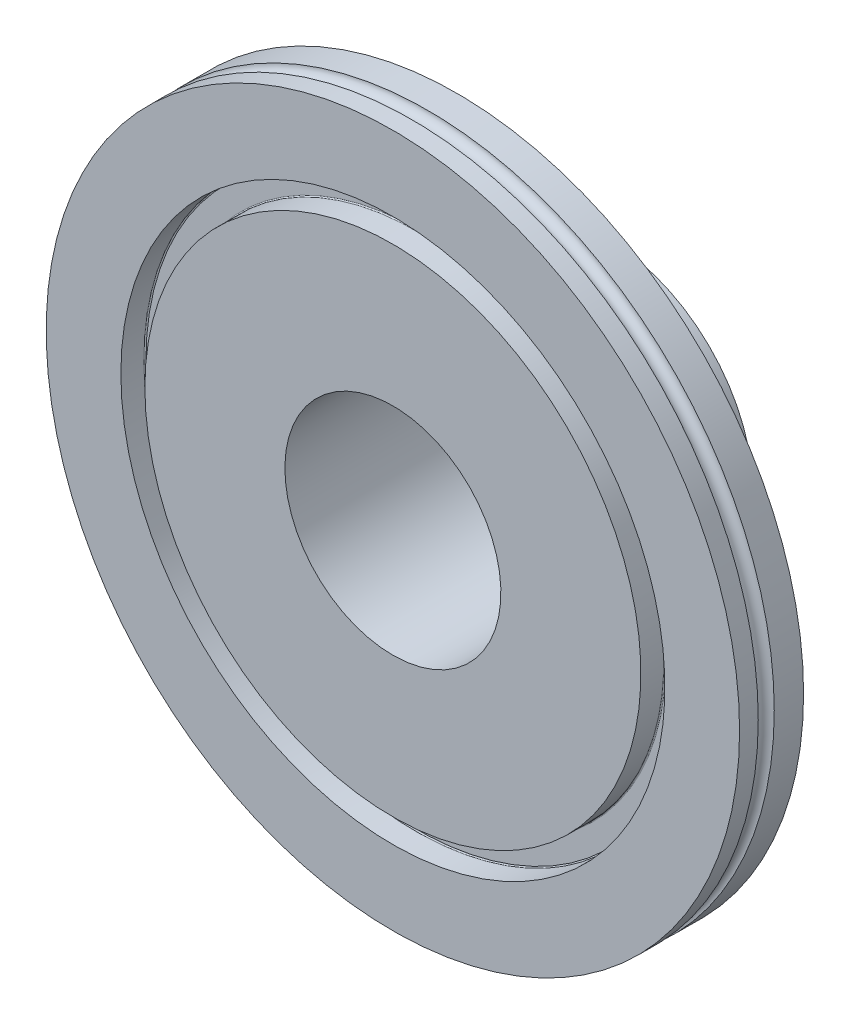
ISO-10303-21;
HEADER;
FILE_DESCRIPTION(('STEP AP214'),'2;1');
FILE_NAME('part.step','',(''),(''),'','','');
FILE_SCHEMA(('AUTOMOTIVE_DESIGN { 1 0 10303 214 1 1 1 1 }'));
ENDSEC;
DATA;
#1=APPLICATION_CONTEXT('core data for automotive mechanical design processes');
#2=APPLICATION_PROTOCOL_DEFINITION('international standard','automotive_design',2000,#1);
#3=PRODUCT_CONTEXT('',#1,'mechanical');
#4=PRODUCT('Part','Part','',(#3));
#5=PRODUCT_RELATED_PRODUCT_CATEGORY('part','',(#4));
#6=PRODUCT_DEFINITION_FORMATION('','',#4);
#7=PRODUCT_DEFINITION_CONTEXT('part definition',#1,'design');
#8=PRODUCT_DEFINITION('design','',#6,#7);
#9=PRODUCT_DEFINITION_SHAPE('','',#8);
#10=(LENGTH_UNIT() NAMED_UNIT(*) SI_UNIT(.MILLI.,.METRE.));
#11=(NAMED_UNIT(*) PLANE_ANGLE_UNIT() SI_UNIT($,.RADIAN.));
#12=(NAMED_UNIT(*) SI_UNIT($,.STERADIAN.) SOLID_ANGLE_UNIT());
#13=UNCERTAINTY_MEASURE_WITH_UNIT(LENGTH_MEASURE(1.E-05),#10,'distance_accuracy_value','');
#14=(GEOMETRIC_REPRESENTATION_CONTEXT(3) GLOBAL_UNCERTAINTY_ASSIGNED_CONTEXT((#13)) GLOBAL_UNIT_ASSIGNED_CONTEXT((#10,
#11,#12)) REPRESENTATION_CONTEXT('',''));
#15=CARTESIAN_POINT('',(0.,0.,0.));
#16=DIRECTION('',(0.,0.,1.));
#17=DIRECTION('',(1.,0.,0.));
#18=AXIS2_PLACEMENT_3D('',#15,#16,#17);
#19=CARTESIAN_POINT('',(0.,0.,0.));
#20=DIRECTION('',(0.,0.,1.));
#21=DIRECTION('',(1.,0.,0.));
#22=AXIS2_PLACEMENT_3D('',#19,#20,#21);
#23=PLANE('',#22);
#24=CARTESIAN_POINT('',(0.,0.,0.));
#25=DIRECTION('',(0.,0.,-1.));
#26=DIRECTION('',(-1.,0.,0.));
#27=AXIS2_PLACEMENT_3D('',#24,#25,#26);
#28=CIRCLE('',#27,20.25);
#29=CARTESIAN_POINT('',(-18.0304776968618,-9.21761216492474,0.));
#30=VERTEX_POINT('',#29);
#31=EDGE_CURVE('E210',#30,#30,#28,.T.);
#32=ORIENTED_EDGE('',*,*,#31,.T.);
#33=EDGE_LOOP('',(#32));
#34=FACE_BOUND('',#33,.T.);
#35=CARTESIAN_POINT('',(0.,0.,0.));
#36=DIRECTION('',(0.,0.,1.));
#37=DIRECTION('',(1.,0.,0.));
#38=AXIS2_PLACEMENT_3D('',#35,#36,#37);
#39=CIRCLE('',#38,46.5);
#40=CARTESIAN_POINT('',(-46.5,0.,0.));
#41=VERTEX_POINT('',#40);
#42=EDGE_CURVE('E198',#41,#41,#39,.T.);
#43=ORIENTED_EDGE('',*,*,#42,.T.);
#44=EDGE_LOOP('',(#43));
#45=FACE_BOUND('',#44,.T.);
#46=ADVANCED_FACE('F17',(#34,#45),#23,.T.);
#47=CARTESIAN_POINT('',(0.,0.,-4.5));
#48=DIRECTION('',(0.,0.,1.));
#49=DIRECTION('',(1.,0.,0.));
#50=AXIS2_PLACEMENT_3D('',#47,#48,#49);
#51=PLANE('',#50);
#52=CARTESIAN_POINT('',(0.,0.,-4.5));
#53=DIRECTION('',(0.,0.,-1.));
#54=DIRECTION('',(1.,0.,0.));
#55=AXIS2_PLACEMENT_3D('',#52,#53,#54);
#56=CIRCLE('',#55,46.7);
#57=CARTESIAN_POINT('',(-46.7,0.,-4.5));
#58=VERTEX_POINT('',#57);
#59=EDGE_CURVE('E302',#58,#58,#56,.T.);
#60=ORIENTED_EDGE('',*,*,#59,.T.);
#61=EDGE_LOOP('',(#60));
#62=FACE_BOUND('',#61,.T.);
#63=CARTESIAN_POINT('',(0.,0.,-4.5));
#64=DIRECTION('',(0.,0.,1.));
#65=DIRECTION('',(1.,0.,0.));
#66=AXIS2_PLACEMENT_3D('',#63,#64,#65);
#67=CIRCLE('',#66,50.8);
#68=CARTESIAN_POINT('',(-50.8,0.,-4.5));
#69=VERTEX_POINT('',#68);
#70=EDGE_CURVE('E226',#69,#69,#67,.T.);
#71=ORIENTED_EDGE('',*,*,#70,.T.);
#72=EDGE_LOOP('',(#71));
#73=FACE_BOUND('',#72,.T.);
#74=ADVANCED_FACE('F328',(#62,#73),#51,.T.);
#75=CARTESIAN_POINT('',(0.,0.,0.));
#76=DIRECTION('',(0.,0.,1.));
#77=DIRECTION('',(1.,0.,0.));
#78=AXIS2_PLACEMENT_3D('',#75,#76,#77);
#79=PLANE('',#78);
#80=CARTESIAN_POINT('',(0.,0.,0.));
#81=DIRECTION('',(0.,0.,1.));
#82=DIRECTION('',(1.,0.,0.));
#83=AXIS2_PLACEMENT_3D('',#80,#81,#82);
#84=CIRCLE('',#83,51.);
#85=CARTESIAN_POINT('',(-51.,0.,0.));
#86=VERTEX_POINT('',#85);
#87=EDGE_CURVE('E184',#86,#86,#84,.T.);
#88=ORIENTED_EDGE('',*,*,#87,.F.);
#89=EDGE_LOOP('',(#88));
#90=FACE_BOUND('',#89,.T.);
#91=CARTESIAN_POINT('',(0.,0.,0.));
#92=DIRECTION('',(0.,0.,1.));
#93=DIRECTION('',(1.,0.,0.));
#94=AXIS2_PLACEMENT_3D('',#91,#92,#93);
#95=CIRCLE('',#94,65.);
#96=CARTESIAN_POINT('',(65.,0.,0.));
#97=VERTEX_POINT('',#96);
#98=EDGE_CURVE('E277',#97,#97,#95,.T.);
#99=ORIENTED_EDGE('',*,*,#98,.T.);
#100=EDGE_LOOP('',(#99));
#101=FACE_BOUND('',#100,.T.);
#102=ADVANCED_FACE('F331',(#90,#101),#79,.T.);
#103=CARTESIAN_POINT('',(0.,0.,-3.));
#104=DIRECTION('',(0.,0.,-1.));
#105=DIRECTION('',(0.,-1.,0.));
#106=AXIS2_PLACEMENT_3D('',#103,#104,#105);
#107=PLANE('',#106);
#108=CARTESIAN_POINT('',(0.,0.,-3.));
#109=DIRECTION('',(0.,0.,-1.));
#110=DIRECTION('',(0.890393960338855,0.455190724193815,0.));
#111=AXIS2_PLACEMENT_3D('',#108,#109,#110);
#112=CIRCLE('',#111,22.25);
#113=CARTESIAN_POINT('',(-19.8112656175395,-10.1279936133124,-3.));
#114=VERTEX_POINT('',#113);
#115=EDGE_CURVE('E234',#114,#114,#112,.T.);
#116=ORIENTED_EDGE('',*,*,#115,.F.);
#117=EDGE_LOOP('',(#116));
#118=FACE_BOUND('',#117,.T.);
#119=CARTESIAN_POINT('',(0.,0.,-3.));
#120=DIRECTION('',(0.,0.,-1.));
#121=DIRECTION('',(-1.,0.,0.));
#122=AXIS2_PLACEMENT_3D('',#119,#120,#121);
#123=CIRCLE('',#122,22.35);
#124=CARTESIAN_POINT('',(22.35,0.,-3.));
#125=VERTEX_POINT('',#124);
#126=EDGE_CURVE('E270',#125,#125,#123,.T.);
#127=ORIENTED_EDGE('',*,*,#126,.T.);
#128=EDGE_LOOP('',(#127));
#129=FACE_BOUND('',#128,.T.);
#130=ADVANCED_FACE('F400',(#118,#129),#107,.T.);
#131=CARTESIAN_POINT('',(0.,0.,-12.));
#132=DIRECTION('',(0.,0.,1.));
#133=DIRECTION('',(1.,0.,0.));
#134=AXIS2_PLACEMENT_3D('',#131,#132,#133);
#135=PLANE('',#134);
#136=CARTESIAN_POINT('',(0.,0.,-12.));
#137=DIRECTION('',(0.,0.,-1.));
#138=DIRECTION('',(-1.,0.,0.));
#139=AXIS2_PLACEMENT_3D('',#136,#137,#138);
#140=CIRCLE('',#139,22.35);
#141=CARTESIAN_POINT('',(22.35,0.,-12.));
#142=VERTEX_POINT('',#141);
#143=EDGE_CURVE('E256',#142,#142,#140,.T.);
#144=ORIENTED_EDGE('',*,*,#143,.F.);
#145=EDGE_LOOP('',(#144));
#146=FACE_BOUND('',#145,.T.);
#147=CARTESIAN_POINT('',(0.,0.,-12.));
#148=DIRECTION('',(0.,0.,-1.));
#149=DIRECTION('',(-1.,0.,0.));
#150=AXIS2_PLACEMENT_3D('',#147,#148,#149);
#151=CIRCLE('',#150,55.);
#152=CARTESIAN_POINT('',(55.,0.,-12.));
#153=VERTEX_POINT('',#152);
#154=EDGE_CURVE('E259',#153,#153,#151,.T.);
#155=ORIENTED_EDGE('',*,*,#154,.T.);
#156=EDGE_LOOP('',(#155));
#157=FACE_BOUND('',#156,.T.);
#158=ADVANCED_FACE('F406',(#146,#157),#135,.F.);
#159=CARTESIAN_POINT('',(0.,0.,-10.5));
#160=DIRECTION('',(0.,0.,-1.));
#161=DIRECTION('',(0.,-1.,0.));
#162=AXIS2_PLACEMENT_3D('',#159,#160,#161);
#163=PLANE('',#162);
#164=CARTESIAN_POINT('',(0.,0.,-10.5));
#165=DIRECTION('',(0.,0.,-1.));
#166=DIRECTION('',(-1.,0.,0.));
#167=AXIS2_PLACEMENT_3D('',#164,#165,#166);
#168=CIRCLE('',#167,55.);
#169=CARTESIAN_POINT('',(55.,0.,-10.5));
#170=VERTEX_POINT('',#169);
#171=EDGE_CURVE('E174',#170,#170,#168,.T.);
#172=ORIENTED_EDGE('',*,*,#171,.F.);
#173=EDGE_LOOP('',(#172));
#174=FACE_BOUND('',#173,.T.);
#175=CARTESIAN_POINT('',(0.,0.,-10.5));
#176=DIRECTION('',(0.,0.,-1.));
#177=DIRECTION('',(-1.,0.,0.));
#178=AXIS2_PLACEMENT_3D('',#175,#176,#177);
#179=CIRCLE('',#178,62.5);
#180=CARTESIAN_POINT('',(62.5,0.,-10.5));
#181=VERTEX_POINT('',#180);
#182=EDGE_CURVE('E177',#181,#181,#179,.T.);
#183=ORIENTED_EDGE('',*,*,#182,.T.);
#184=EDGE_LOOP('',(#183));
#185=FACE_BOUND('',#184,.T.);
#186=ADVANCED_FACE('F446',(#174,#185),#163,.T.);
#187=CARTESIAN_POINT('',(0.,0.,-12.));
#188=DIRECTION('',(0.,0.,1.));
#189=DIRECTION('',(1.,0.,0.));
#190=AXIS2_PLACEMENT_3D('',#187,#188,#189);
#191=PLANE('',#190);
#192=CARTESIAN_POINT('',(0.,0.,-12.));
#193=DIRECTION('',(0.,0.,-1.));
#194=DIRECTION('',(-1.,0.,0.));
#195=AXIS2_PLACEMENT_3D('',#192,#193,#194);
#196=CIRCLE('',#195,62.5);
#197=CARTESIAN_POINT('',(62.5,0.,-12.));
#198=VERTEX_POINT('',#197);
#199=EDGE_CURVE('E252',#198,#198,#196,.T.);
#200=ORIENTED_EDGE('',*,*,#199,.F.);
#201=EDGE_LOOP('',(#200));
#202=FACE_BOUND('',#201,.T.);
#203=CARTESIAN_POINT('',(0.,0.,-12.));
#204=DIRECTION('',(0.,0.,1.));
#205=DIRECTION('',(1.,0.,0.));
#206=AXIS2_PLACEMENT_3D('',#203,#204,#205);
#207=CIRCLE('',#206,65.);
#208=CARTESIAN_POINT('',(65.,0.,-12.));
#209=VERTEX_POINT('',#208);
#210=EDGE_CURVE('E247',#209,#209,#207,.T.);
#211=ORIENTED_EDGE('',*,*,#210,.F.);
#212=EDGE_LOOP('',(#211));
#213=FACE_BOUND('',#212,.T.);
#214=ADVANCED_FACE('F418',(#202,#213),#191,.F.);
#215=CARTESIAN_POINT('',(9.37692891839258,-18.3421155829804,-40.));
#216=DIRECTION('',(0.,0.,-1.));
#217=DIRECTION('',(0.,-1.,0.));
#218=AXIS2_PLACEMENT_3D('',#215,#216,#217);
#219=PLANE('',#218);
#220=CARTESIAN_POINT('',(0.,0.,-40.));
#221=DIRECTION('',(0.,0.,-1.));
#222=DIRECTION('',(0.890393960338855,0.455190724193815,0.));
#223=AXIS2_PLACEMENT_3D('',#220,#221,#222);
#224=CIRCLE('',#223,20.6);
#225=CARTESIAN_POINT('',(-18.3421155829804,-9.37692891839258,-40.));
#226=VERTEX_POINT('',#225);
#227=EDGE_CURVE('E204',#226,#226,#224,.T.);
#228=ORIENTED_EDGE('',*,*,#227,.F.);
#229=EDGE_LOOP('',(#228));
#230=FACE_BOUND('',#229,.T.);
#231=CARTESIAN_POINT('',(0.,0.,-40.));
#232=DIRECTION('',(0.,0.,-1.));
#233=DIRECTION('',(0.890393960338855,0.455190724193815,0.));
#234=AXIS2_PLACEMENT_3D('',#231,#232,#233);
#235=CIRCLE('',#234,27.5);
#236=CARTESIAN_POINT('',(-24.4858339093185,-12.5177449153299,-40.));
#237=VERTEX_POINT('',#236);
#238=EDGE_CURVE('E28',#237,#237,#235,.T.);
#239=ORIENTED_EDGE('',*,*,#238,.T.);
#240=EDGE_LOOP('',(#239));
#241=FACE_BOUND('',#240,.T.);
#242=ADVANCED_FACE('F445',(#230,#241),#219,.T.);
#243=CARTESIAN_POINT('',(9.37692891839258,-18.3421155829804,-37.5));
#244=DIRECTION('',(0.,0.,1.));
#245=DIRECTION('',(1.,0.,0.));
#246=AXIS2_PLACEMENT_3D('',#243,#244,#245);
#247=PLANE('',#246);
#248=CARTESIAN_POINT('',(0.,0.,-37.5));
#249=DIRECTION('',(0.,0.,-1.));
#250=DIRECTION('',(0.890393960338855,0.455190724193814,0.));
#251=AXIS2_PLACEMENT_3D('',#248,#249,#250);
#252=CIRCLE('',#251,20.25);
#253=CARTESIAN_POINT('',(-18.0304776968618,-9.21761216492474,-37.5));
#254=VERTEX_POINT('',#253);
#255=EDGE_CURVE('E235',#254,#254,#252,.T.);
#256=ORIENTED_EDGE('',*,*,#255,.F.);
#257=EDGE_LOOP('',(#256));
#258=FACE_BOUND('',#257,.T.);
#259=CARTESIAN_POINT('',(0.,0.,-37.5));
#260=DIRECTION('',(0.,0.,-1.));
#261=DIRECTION('',(-0.890393960338855,-0.455190724193815,0.));
#262=AXIS2_PLACEMENT_3D('',#259,#260,#261);
#263=CIRCLE('',#262,20.3);
#264=CARTESIAN_POINT('',(18.0749973948788,9.24037170113444,-37.5));
#265=VERTEX_POINT('',#264);
#266=EDGE_CURVE('E190',#265,#265,#263,.T.);
#267=ORIENTED_EDGE('',*,*,#266,.T.);
#268=EDGE_LOOP('',(#267));
#269=FACE_BOUND('',#268,.T.);
#270=ADVANCED_FACE('F19',(#258,#269),#247,.F.);
#271=CARTESIAN_POINT('',(0.,0.,-40.));
#272=DIRECTION('',(0.,0.,-1.));
#273=DIRECTION('',(0.890393960338855,0.455190724193815,0.));
#274=AXIS2_PLACEMENT_3D('',#271,#272,#273);
#275=CYLINDRICAL_SURFACE('',#274,27.5);
#276=ORIENTED_EDGE('',*,*,#238,.F.);
#277=DIRECTION('',(0.,0.,1.));
#278=VECTOR('',#277,1.);
#279=CARTESIAN_POINT('',(-24.4858339093185,-12.5177449153299,-40.));
#280=LINE('',#279,#278);
#281=CARTESIAN_POINT('',(-24.4858339093185,-12.5177449153299,-37.767326987979));
#282=VERTEX_POINT('',#281);
#283=EDGE_CURVE('E11',#237,#282,#280,.T.);
#284=ORIENTED_EDGE('',*,*,#283,.T.);
#285=CARTESIAN_POINT('',(0.,0.,-37.767326987979));
#286=DIRECTION('',(0.,0.,-1.));
#287=DIRECTION('',(-0.890393960338855,-0.455190724193815,0.));
#288=AXIS2_PLACEMENT_3D('',#285,#286,#287);
#289=CIRCLE('',#288,27.5);
#290=CARTESIAN_POINT('',(24.4858339093185,12.5177449153299,-37.767326987979));
#291=VERTEX_POINT('',#290);
#292=EDGE_CURVE('E152',#282,#291,#289,.T.);
#293=ORIENTED_EDGE('',*,*,#292,.T.);
#294=CARTESIAN_POINT('',(0.,0.,-37.767326987979));
#295=DIRECTION('',(0.,0.,-1.));
#296=DIRECTION('',(-0.890393960338855,-0.455190724193815,0.));
#297=AXIS2_PLACEMENT_3D('',#294,#295,#296);
#298=CIRCLE('',#297,27.5);
#299=EDGE_CURVE('E146',#291,#282,#298,.T.);
#300=ORIENTED_EDGE('',*,*,#299,.T.);
#301=ORIENTED_EDGE('',*,*,#283,.F.);
#302=EDGE_LOOP('',(#276,#284,#293,#300,#301));
#303=FACE_BOUND('',#302,.T.);
#304=ADVANCED_FACE('F156',(#303),#275,.T.);
#305=CARTESIAN_POINT('',(0.,0.,-37.));
#306=DIRECTION('',(0.,0.,-1.));
#307=DIRECTION('',(0.890393960338855,0.455190724193815,0.));
#308=AXIS2_PLACEMENT_3D('',#305,#306,#307);
#309=CONICAL_SURFACE('',#308,27.5,1.30899693899575);
#310=CARTESIAN_POINT('',(0.,0.,-36.8014011616899));
#311=DIRECTION('',(0.,0.,1.));
#312=DIRECTION('',(-0.890393960338855,-0.455190724193815,0.));
#313=AXIS2_PLACEMENT_3D('',#310,#311,#312);
#314=CIRCLE('',#313,26.7588190451025);
#315=CARTESIAN_POINT('',(-23.8258908635596,-12.1803662197115,-36.8014011616899));
#316=VERTEX_POINT('',#315);
#317=CARTESIAN_POINT('',(23.8258908635596,12.1803662197115,-36.8014011616899));
#318=VERTEX_POINT('',#317);
#319=EDGE_CURVE('E168',#316,#318,#314,.T.);
#320=ORIENTED_EDGE('',*,*,#319,.T.);
#321=CARTESIAN_POINT('',(0.,0.,-36.8014011616899));
#322=DIRECTION('',(0.,0.,1.));
#323=DIRECTION('',(-0.890393960338855,-0.455190724193815,0.));
#324=AXIS2_PLACEMENT_3D('',#321,#322,#323);
#325=CIRCLE('',#324,26.7588190451025);
#326=EDGE_CURVE('E160',#318,#316,#325,.T.);
#327=ORIENTED_EDGE('',*,*,#326,.T.);
#328=DIRECTION('',(0.860054521863106,0.439680476386031,0.258819045102515));
#329=VECTOR('',#328,1.);
#330=CARTESIAN_POINT('',(-24.4858339093185,-12.5177449153299,-37.));
#331=LINE('',#330,#329);
#332=CARTESIAN_POINT('',(-20.2072314449949,-10.3304208306834,-35.7124260427227));
#333=VERTEX_POINT('',#332);
#334=EDGE_CURVE('E21',#316,#333,#331,.T.);
#335=ORIENTED_EDGE('',*,*,#334,.T.);
#336=CARTESIAN_POINT('',(0.,0.,-35.7124260427227));
#337=DIRECTION('',(0.,0.,-1.));
#338=DIRECTION('',(0.890393960338855,0.455190724193815,0.));
#339=AXIS2_PLACEMENT_3D('',#336,#337,#338);
#340=CIRCLE('',#339,22.6947085729385);
#341=EDGE_CURVE('E193',#333,#333,#340,.T.);
#342=ORIENTED_EDGE('',*,*,#341,.T.);
#343=ORIENTED_EDGE('',*,*,#334,.F.);
#344=EDGE_LOOP('',(#320,#327,#335,#342,#343));
#345=FACE_BOUND('',#344,.T.);
#346=ADVANCED_FACE('F483',(#345),#309,.T.);
#347=CARTESIAN_POINT('',(0.,0.,-40.));
#348=DIRECTION('',(0.,0.,-1.));
#349=DIRECTION('',(0.890393960338855,0.455190724193815,0.));
#350=AXIS2_PLACEMENT_3D('',#347,#348,#349);
#351=CYLINDRICAL_SURFACE('',#350,22.25);
#352=CARTESIAN_POINT('',(0.,0.,-35.1328705469493));
#353=DIRECTION('',(0.,0.,1.));
#354=DIRECTION('',(0.890393960338855,0.455190724193815,0.));
#355=AXIS2_PLACEMENT_3D('',#352,#353,#354);
#356=CIRCLE('',#355,22.25);
#357=CARTESIAN_POINT('',(-19.8112656175395,-10.1279936133124,-35.1328705469493));
#358=VERTEX_POINT('',#357);
#359=EDGE_CURVE('E236',#358,#358,#356,.T.);
#360=ORIENTED_EDGE('',*,*,#359,.T.);
#361=DIRECTION('',(0.,0.,1.));
#362=VECTOR('',#361,1.);
#363=CARTESIAN_POINT('',(-19.8112656175395,-10.1279936133124,-40.));
#364=LINE('',#363,#362);
#365=EDGE_CURVE('E230',#358,#114,#364,.T.);
#366=ORIENTED_EDGE('',*,*,#365,.T.);
#367=ORIENTED_EDGE('',*,*,#115,.T.);
#368=ORIENTED_EDGE('',*,*,#365,.F.);
#369=EDGE_LOOP('',(#360,#366,#367,#368));
#370=FACE_BOUND('',#369,.T.);
#371=ADVANCED_FACE('F495',(#370),#351,.T.);
#372=CARTESIAN_POINT('',(0.,0.,-40.));
#373=DIRECTION('',(0.,0.,-1.));
#374=DIRECTION('',(0.890393960338855,0.455190724193815,0.));
#375=AXIS2_PLACEMENT_3D('',#372,#373,#374);
#376=CYLINDRICAL_SURFACE('',#375,20.25);
#377=ORIENTED_EDGE('',*,*,#31,.F.);
#378=DIRECTION('',(0.,0.,-1.));
#379=VECTOR('',#378,1.);
#380=CARTESIAN_POINT('',(-18.0304776968618,-9.21761216492474,-40.));
#381=LINE('',#380,#379);
#382=EDGE_CURVE('E217',#30,#254,#381,.T.);
#383=ORIENTED_EDGE('',*,*,#382,.T.);
#384=ORIENTED_EDGE('',*,*,#255,.T.);
#385=ORIENTED_EDGE('',*,*,#382,.F.);
#386=EDGE_LOOP('',(#377,#383,#384,#385));
#387=FACE_BOUND('',#386,.T.);
#388=ADVANCED_FACE('F423',(#387),#376,.F.);
#389=CARTESIAN_POINT('',(0.,0.,-40.));
#390=DIRECTION('',(0.,0.,-1.));
#391=DIRECTION('',(0.890393960338855,0.455190724193815,0.));
#392=AXIS2_PLACEMENT_3D('',#389,#390,#391);
#393=CYLINDRICAL_SURFACE('',#392,20.6);
#394=CARTESIAN_POINT('',(0.,0.,-37.8));
#395=DIRECTION('',(0.,0.,1.));
#396=DIRECTION('',(-0.890393960338855,-0.455190724193815,0.));
#397=AXIS2_PLACEMENT_3D('',#394,#395,#396);
#398=CIRCLE('',#397,20.6);
#399=CARTESIAN_POINT('',(-18.3421155829804,-9.37692891839258,-37.8));
#400=VERTEX_POINT('',#399);
#401=CARTESIAN_POINT('',(18.3421155829804,9.37692891839258,-37.8));
#402=VERTEX_POINT('',#401);
#403=EDGE_CURVE('E343',#400,#402,#398,.T.);
#404=ORIENTED_EDGE('',*,*,#403,.T.);
#405=CARTESIAN_POINT('',(0.,0.,-37.8));
#406=DIRECTION('',(0.,0.,1.));
#407=DIRECTION('',(-0.890393960338855,-0.455190724193815,0.));
#408=AXIS2_PLACEMENT_3D('',#405,#406,#407);
#409=CIRCLE('',#408,20.6);
#410=EDGE_CURVE('E244',#402,#400,#409,.T.);
#411=ORIENTED_EDGE('',*,*,#410,.T.);
#412=DIRECTION('',(0.,0.,-1.));
#413=VECTOR('',#412,1.);
#414=CARTESIAN_POINT('',(-18.3421155829804,-9.37692891839258,-40.));
#415=LINE('',#414,#413);
#416=EDGE_CURVE('E154',#400,#226,#415,.T.);
#417=ORIENTED_EDGE('',*,*,#416,.T.);
#418=ORIENTED_EDGE('',*,*,#227,.T.);
#419=ORIENTED_EDGE('',*,*,#416,.F.);
#420=EDGE_LOOP('',(#404,#411,#417,#418,#419));
#421=FACE_BOUND('',#420,.T.);
#422=ADVANCED_FACE('F420',(#421),#393,.F.);
#423=CARTESIAN_POINT('',(0.,0.,-37.767326987979));
#424=DIRECTION('',(0.,0.,1.));
#425=DIRECTION('',(-0.890393960338855,-0.455190724193815,0.));
#426=AXIS2_PLACEMENT_3D('',#423,#424,#425);
#427=TOROIDAL_SURFACE('',#426,26.5,1.);
#428=ORIENTED_EDGE('',*,*,#319,.F.);
#429=ORIENTED_EDGE('',*,*,#326,.F.);
#430=CARTESIAN_POINT('',(23.5954399489797,12.0625541911361,-37.767326987979));
#431=DIRECTION('',(-0.455190724193815,0.890393960338855,0.));
#432=DIRECTION('',(0.890393960338855,0.455190724193815,0.));
#433=AXIS2_PLACEMENT_3D('',#430,#431,#432);
#434=CIRCLE('',#433,1.);
#435=EDGE_CURVE('E150',#318,#291,#434,.T.);
#436=ORIENTED_EDGE('',*,*,#435,.T.);
#437=ORIENTED_EDGE('',*,*,#292,.F.);
#438=ORIENTED_EDGE('',*,*,#299,.F.);
#439=ORIENTED_EDGE('',*,*,#435,.F.);
#440=EDGE_LOOP('',(#428,#429,#436,#437,#438,#439));
#441=FACE_BOUND('',#440,.T.);
#442=ADVANCED_FACE('F148',(#441),#427,.T.);
#443=CARTESIAN_POINT('',(0.,0.,-35.1328705469493));
#444=DIRECTION('',(0.,0.,-1.));
#445=DIRECTION('',(0.890393960338855,0.455190724193815,0.));
#446=AXIS2_PLACEMENT_3D('',#443,#444,#445);
#447=TOROIDAL_SURFACE('',#446,22.85,0.6);
#448=ORIENTED_EDGE('',*,*,#341,.F.);
#449=CARTESIAN_POINT('',(-20.3455019937428,-10.4011080478287,-35.1328705469493));
#450=DIRECTION('',(0.455190724193814,-0.890393960338855,0.));
#451=DIRECTION('',(-0.890393960338855,-0.455190724193814,0.));
#452=AXIS2_PLACEMENT_3D('',#449,#450,#451);
#453=CIRCLE('',#452,0.6);
#454=EDGE_CURVE('E240',#333,#358,#453,.T.);
#455=ORIENTED_EDGE('',*,*,#454,.T.);
#456=ORIENTED_EDGE('',*,*,#359,.F.);
#457=ORIENTED_EDGE('',*,*,#454,.F.);
#458=EDGE_LOOP('',(#448,#455,#456,#457));
#459=FACE_BOUND('',#458,.T.);
#460=ADVANCED_FACE('F438',(#459),#447,.F.);
#461=CARTESIAN_POINT('',(0.,0.,-37.8));
#462=DIRECTION('',(0.,0.,1.));
#463=DIRECTION('',(-0.890393960338855,-0.455190724193815,0.));
#464=AXIS2_PLACEMENT_3D('',#461,#462,#463);
#465=TOROIDAL_SURFACE('',#464,20.3,0.3);
#466=ORIENTED_EDGE('',*,*,#403,.F.);
#467=ORIENTED_EDGE('',*,*,#410,.F.);
#468=CARTESIAN_POINT('',(18.0749973948788,9.24037170113444,-37.8));
#469=DIRECTION('',(0.455190724193815,-0.890393960338855,0.));
#470=DIRECTION('',(0.890393960338855,0.455190724193815,0.));
#471=AXIS2_PLACEMENT_3D('',#468,#469,#470);
#472=CIRCLE('',#471,0.3);
#473=EDGE_CURVE('E194',#402,#265,#472,.T.);
#474=ORIENTED_EDGE('',*,*,#473,.T.);
#475=ORIENTED_EDGE('',*,*,#266,.F.);
#476=ORIENTED_EDGE('',*,*,#473,.F.);
#477=EDGE_LOOP('',(#466,#467,#474,#475,#476));
#478=FACE_BOUND('',#477,.T.);
#479=ADVANCED_FACE('F430',(#478),#465,.F.);
#480=CARTESIAN_POINT('',(0.,0.,0.));
#481=DIRECTION('',(0.,0.,-1.));
#482=DIRECTION('',(-1.,0.,0.));
#483=AXIS2_PLACEMENT_3D('',#480,#481,#482);
#484=CYLINDRICAL_SURFACE('',#483,65.);
#485=ORIENTED_EDGE('',*,*,#210,.T.);
#486=DIRECTION('',(0.,0.,1.));
#487=VECTOR('',#486,1.);
#488=CARTESIAN_POINT('',(65.,0.,0.));
#489=LINE('',#488,#487);
#490=CARTESIAN_POINT('',(65.,0.,-6.5));
#491=VERTEX_POINT('',#490);
#492=EDGE_CURVE('E251',#209,#491,#489,.T.);
#493=ORIENTED_EDGE('',*,*,#492,.T.);
#494=CARTESIAN_POINT('',(0.,0.,-6.5));
#495=DIRECTION('',(0.,0.,-1.));
#496=DIRECTION('',(1.,0.,0.));
#497=AXIS2_PLACEMENT_3D('',#494,#495,#496);
#498=CIRCLE('',#497,65.);
#499=CARTESIAN_POINT('',(-65.,0.,-6.5));
#500=VERTEX_POINT('',#499);
#501=EDGE_CURVE('E288',#491,#500,#498,.T.);
#502=ORIENTED_EDGE('',*,*,#501,.T.);
#503=CARTESIAN_POINT('',(0.,0.,-6.5));
#504=DIRECTION('',(0.,0.,-1.));
#505=DIRECTION('',(1.,0.,0.));
#506=AXIS2_PLACEMENT_3D('',#503,#504,#505);
#507=CIRCLE('',#506,65.);
#508=EDGE_CURVE('E221',#500,#491,#507,.T.);
#509=ORIENTED_EDGE('',*,*,#508,.T.);
#510=ORIENTED_EDGE('',*,*,#492,.F.);
#511=EDGE_LOOP('',(#485,#493,#502,#509,#510));
#512=FACE_BOUND('',#511,.T.);
#513=ADVANCED_FACE('F427',(#512),#484,.T.);
#514=CARTESIAN_POINT('',(0.,0.,-10.5));
#515=DIRECTION('',(0.,0.,-1.));
#516=DIRECTION('',(-1.,0.,0.));
#517=AXIS2_PLACEMENT_3D('',#514,#515,#516);
#518=CYLINDRICAL_SURFACE('',#517,62.5);
#519=ORIENTED_EDGE('',*,*,#182,.F.);
#520=DIRECTION('',(0.,0.,-1.));
#521=VECTOR('',#520,1.);
#522=CARTESIAN_POINT('',(62.5,0.,-10.5));
#523=LINE('',#522,#521);
#524=EDGE_CURVE('E255',#181,#198,#523,.T.);
#525=ORIENTED_EDGE('',*,*,#524,.T.);
#526=ORIENTED_EDGE('',*,*,#199,.T.);
#527=ORIENTED_EDGE('',*,*,#524,.F.);
#528=EDGE_LOOP('',(#519,#525,#526,#527));
#529=FACE_BOUND('',#528,.T.);
#530=ADVANCED_FACE('F429',(#529),#518,.F.);
#531=CARTESIAN_POINT('',(0.,0.,-10.5));
#532=DIRECTION('',(0.,0.,-1.));
#533=DIRECTION('',(-1.,0.,0.));
#534=AXIS2_PLACEMENT_3D('',#531,#532,#533);
#535=CYLINDRICAL_SURFACE('',#534,55.);
#536=ORIENTED_EDGE('',*,*,#154,.F.);
#537=DIRECTION('',(0.,0.,1.));
#538=VECTOR('',#537,1.);
#539=CARTESIAN_POINT('',(55.,0.,-10.5));
#540=LINE('',#539,#538);
#541=EDGE_CURVE('E172',#153,#170,#540,.T.);
#542=ORIENTED_EDGE('',*,*,#541,.T.);
#543=ORIENTED_EDGE('',*,*,#171,.T.);
#544=ORIENTED_EDGE('',*,*,#541,.F.);
#545=EDGE_LOOP('',(#536,#542,#543,#544));
#546=FACE_BOUND('',#545,.T.);
#547=ADVANCED_FACE('F426',(#546),#535,.T.);
#548=CARTESIAN_POINT('',(0.,0.,-3.));
#549=DIRECTION('',(0.,0.,-1.));
#550=DIRECTION('',(-1.,0.,0.));
#551=AXIS2_PLACEMENT_3D('',#548,#549,#550);
#552=CYLINDRICAL_SURFACE('',#551,22.35);
#553=ORIENTED_EDGE('',*,*,#126,.F.);
#554=DIRECTION('',(0.,0.,-1.));
#555=VECTOR('',#554,1.);
#556=CARTESIAN_POINT('',(22.35,0.,-3.));
#557=LINE('',#556,#555);
#558=EDGE_CURVE('E260',#125,#142,#557,.T.);
#559=ORIENTED_EDGE('',*,*,#558,.T.);
#560=ORIENTED_EDGE('',*,*,#143,.T.);
#561=ORIENTED_EDGE('',*,*,#558,.F.);
#562=EDGE_LOOP('',(#553,#559,#560,#561));
#563=FACE_BOUND('',#562,.T.);
#564=ADVANCED_FACE('F424',(#563),#552,.F.);
#565=CARTESIAN_POINT('',(0.,0.,0.));
#566=DIRECTION('',(0.,0.,-1.));
#567=DIRECTION('',(-1.,0.,0.));
#568=AXIS2_PLACEMENT_3D('',#565,#566,#567);
#569=CYLINDRICAL_SURFACE('',#568,65.);
#570=CARTESIAN_POINT('',(0.,0.,-3.5));
#571=DIRECTION('',(0.,0.,1.));
#572=DIRECTION('',(-1.,0.,0.));
#573=AXIS2_PLACEMENT_3D('',#570,#571,#572);
#574=CIRCLE('',#573,65.);
#575=CARTESIAN_POINT('',(-65.,0.,-3.5));
#576=VERTEX_POINT('',#575);
#577=CARTESIAN_POINT('',(65.,0.,-3.5));
#578=VERTEX_POINT('',#577);
#579=EDGE_CURVE('E289',#576,#578,#574,.T.);
#580=ORIENTED_EDGE('',*,*,#579,.T.);
#581=DIRECTION('',(0.,0.,1.));
#582=VECTOR('',#581,1.);
#583=CARTESIAN_POINT('',(65.,0.,0.));
#584=LINE('',#583,#582);
#585=EDGE_CURVE('E188',#578,#97,#584,.T.);
#586=ORIENTED_EDGE('',*,*,#585,.T.);
#587=ORIENTED_EDGE('',*,*,#98,.F.);
#588=ORIENTED_EDGE('',*,*,#585,.F.);
#589=CARTESIAN_POINT('',(0.,0.,-3.5));
#590=DIRECTION('',(0.,0.,1.));
#591=DIRECTION('',(-1.,0.,0.));
#592=AXIS2_PLACEMENT_3D('',#589,#590,#591);
#593=CIRCLE('',#592,65.);
#594=EDGE_CURVE('E280',#578,#576,#593,.T.);
#595=ORIENTED_EDGE('',*,*,#594,.T.);
#596=EDGE_LOOP('',(#580,#586,#587,#588,#595));
#597=FACE_BOUND('',#596,.T.);
#598=ADVANCED_FACE('F372',(#597),#569,.T.);
#599=CARTESIAN_POINT('',(0.,0.,-4.5));
#600=DIRECTION('',(0.,0.,1.));
#601=DIRECTION('',(1.,0.,0.));
#602=AXIS2_PLACEMENT_3D('',#599,#600,#601);
#603=CYLINDRICAL_SURFACE('',#602,51.);
#604=CARTESIAN_POINT('',(0.,0.,-4.3));
#605=DIRECTION('',(0.,0.,-1.));
#606=DIRECTION('',(1.,0.,0.));
#607=AXIS2_PLACEMENT_3D('',#604,#605,#606);
#608=CIRCLE('',#607,51.);
#609=CARTESIAN_POINT('',(-51.,0.,-4.3));
#610=VERTEX_POINT('',#609);
#611=EDGE_CURVE('E201',#610,#610,#608,.T.);
#612=ORIENTED_EDGE('',*,*,#611,.T.);
#613=DIRECTION('',(0.,0.,1.));
#614=VECTOR('',#613,1.);
#615=CARTESIAN_POINT('',(-51.,0.,-4.5));
#616=LINE('',#615,#614);
#617=EDGE_CURVE('E189',#610,#86,#616,.T.);
#618=ORIENTED_EDGE('',*,*,#617,.T.);
#619=ORIENTED_EDGE('',*,*,#87,.T.);
#620=ORIENTED_EDGE('',*,*,#617,.F.);
#621=EDGE_LOOP('',(#612,#618,#619,#620));
#622=FACE_BOUND('',#621,.T.);
#623=ADVANCED_FACE('F397',(#622),#603,.F.);
#624=CARTESIAN_POINT('',(0.,0.,-4.3));
#625=DIRECTION('',(0.,0.,1.));
#626=DIRECTION('',(1.,0.,0.));
#627=AXIS2_PLACEMENT_3D('',#624,#625,#626);
#628=TOROIDAL_SURFACE('',#627,50.8,0.2);
#629=ORIENTED_EDGE('',*,*,#70,.F.);
#630=CARTESIAN_POINT('',(-50.8,0.,-4.3));
#631=DIRECTION('',(0.,1.,0.));
#632=DIRECTION('',(-1.,0.,0.));
#633=AXIS2_PLACEMENT_3D('',#630,#631,#632);
#634=CIRCLE('',#633,0.2);
#635=EDGE_CURVE('E222',#69,#610,#634,.T.);
#636=ORIENTED_EDGE('',*,*,#635,.T.);
#637=ORIENTED_EDGE('',*,*,#611,.F.);
#638=ORIENTED_EDGE('',*,*,#635,.F.);
#639=EDGE_LOOP('',(#629,#636,#637,#638));
#640=FACE_BOUND('',#639,.T.);
#641=ADVANCED_FACE('F474',(#640),#628,.F.);
#642=CARTESIAN_POINT('',(0.,0.,-4.3));
#643=DIRECTION('',(0.,0.,1.));
#644=DIRECTION('',(1.,0.,0.));
#645=AXIS2_PLACEMENT_3D('',#642,#643,#644);
#646=TOROIDAL_SURFACE('',#645,46.7,0.2);
#647=CARTESIAN_POINT('',(0.,0.,-4.3));
#648=DIRECTION('',(0.,0.,1.));
#649=DIRECTION('',(1.,0.,0.));
#650=AXIS2_PLACEMENT_3D('',#647,#648,#649);
#651=CIRCLE('',#650,46.5);
#652=CARTESIAN_POINT('',(-46.5,0.,-4.3));
#653=VERTEX_POINT('',#652);
#654=EDGE_CURVE('E178',#653,#653,#651,.T.);
#655=ORIENTED_EDGE('',*,*,#654,.F.);
#656=CARTESIAN_POINT('',(-46.7,0.,-4.3));
#657=DIRECTION('',(0.,1.,0.));
#658=DIRECTION('',(-1.,0.,0.));
#659=AXIS2_PLACEMENT_3D('',#656,#657,#658);
#660=CIRCLE('',#659,0.2);
#661=EDGE_CURVE('E182',#653,#58,#660,.T.);
#662=ORIENTED_EDGE('',*,*,#661,.T.);
#663=ORIENTED_EDGE('',*,*,#59,.F.);
#664=ORIENTED_EDGE('',*,*,#661,.F.);
#665=EDGE_LOOP('',(#655,#662,#663,#664));
#666=FACE_BOUND('',#665,.T.);
#667=ADVANCED_FACE('F325',(#666),#646,.F.);
#668=CARTESIAN_POINT('',(0.,0.,-4.5));
#669=DIRECTION('',(0.,0.,1.));
#670=DIRECTION('',(1.,0.,0.));
#671=AXIS2_PLACEMENT_3D('',#668,#669,#670);
#672=CYLINDRICAL_SURFACE('',#671,46.5);
#673=ORIENTED_EDGE('',*,*,#42,.F.);
#674=DIRECTION('',(0.,0.,-1.));
#675=VECTOR('',#674,1.);
#676=CARTESIAN_POINT('',(-46.5,0.,-4.5));
#677=LINE('',#676,#675);
#678=EDGE_CURVE('E183',#41,#653,#677,.T.);
#679=ORIENTED_EDGE('',*,*,#678,.T.);
#680=ORIENTED_EDGE('',*,*,#654,.T.);
#681=ORIENTED_EDGE('',*,*,#678,.F.);
#682=EDGE_LOOP('',(#673,#679,#680,#681));
#683=FACE_BOUND('',#682,.T.);
#684=ADVANCED_FACE('F322',(#683),#672,.T.);
#685=CARTESIAN_POINT('',(0.,0.,-5.));
#686=DIRECTION('',(0.,0.,1.));
#687=DIRECTION('',(1.,0.,0.));
#688=AXIS2_PLACEMENT_3D('',#685,#686,#687);
#689=TOROIDAL_SURFACE('',#688,65.,1.5);
#690=ORIENTED_EDGE('',*,*,#579,.F.);
#691=CARTESIAN_POINT('',(-65.,0.,-5.));
#692=DIRECTION('',(0.,1.,0.));
#693=DIRECTION('',(-1.,0.,0.));
#694=AXIS2_PLACEMENT_3D('',#691,#692,#693);
#695=CIRCLE('',#694,1.5);
#696=EDGE_CURVE('E284',#576,#500,#695,.T.);
#697=ORIENTED_EDGE('',*,*,#696,.T.);
#698=ORIENTED_EDGE('',*,*,#501,.F.);
#699=ORIENTED_EDGE('',*,*,#508,.F.);
#700=ORIENTED_EDGE('',*,*,#696,.F.);
#701=ORIENTED_EDGE('',*,*,#594,.F.);
#702=EDGE_LOOP('',(#690,#697,#698,#699,#700,#701));
#703=FACE_BOUND('',#702,.T.);
#704=ADVANCED_FACE('F377',(#703),#689,.F.);
#705=CLOSED_SHELL('',(#46,#74,#102,#130,#158,#186,#214,#242,#270,#304,#346,#371,#388,#422,#442,
#460,#479,#513,#530,#547,#564,#598,#623,#641,#667,#684,#704));
#706=MANIFOLD_SOLID_BREP('B1',#705);
#707=ADVANCED_BREP_SHAPE_REPRESENTATION('',(#18,#706),#14);
#708=SHAPE_DEFINITION_REPRESENTATION(#9,#707);
ENDSEC;
END-ISO-10303-21;
